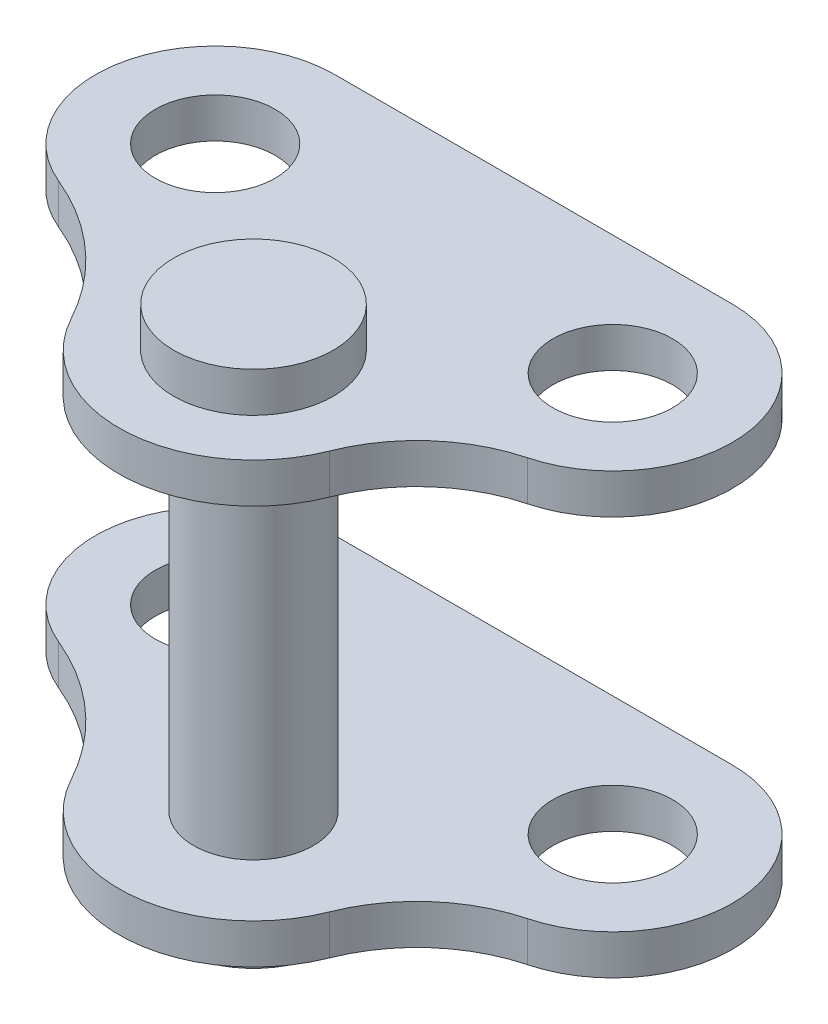
ISO-10303-21;
HEADER;
FILE_DESCRIPTION(('STEP AP214'),'2;1');
FILE_NAME('part.step','',(''),(''),'','','');
FILE_SCHEMA(('AUTOMOTIVE_DESIGN { 1 0 10303 214 1 1 1 1 }'));
ENDSEC;
DATA;
#1=APPLICATION_CONTEXT('core data for automotive mechanical design processes');
#2=APPLICATION_PROTOCOL_DEFINITION('international standard','automotive_design',2000,#1);
#3=PRODUCT_CONTEXT('',#1,'mechanical');
#4=PRODUCT('Part','Part','',(#3));
#5=PRODUCT_RELATED_PRODUCT_CATEGORY('part','',(#4));
#6=PRODUCT_DEFINITION_FORMATION('','',#4);
#7=PRODUCT_DEFINITION_CONTEXT('part definition',#1,'design');
#8=PRODUCT_DEFINITION('design','',#6,#7);
#9=PRODUCT_DEFINITION_SHAPE('','',#8);
#10=(LENGTH_UNIT() NAMED_UNIT(*) SI_UNIT(.MILLI.,.METRE.));
#11=(NAMED_UNIT(*) PLANE_ANGLE_UNIT() SI_UNIT($,.RADIAN.));
#12=(NAMED_UNIT(*) SI_UNIT($,.STERADIAN.) SOLID_ANGLE_UNIT());
#13=UNCERTAINTY_MEASURE_WITH_UNIT(LENGTH_MEASURE(1.E-05),#10,'distance_accuracy_value','');
#14=(GEOMETRIC_REPRESENTATION_CONTEXT(3) GLOBAL_UNCERTAINTY_ASSIGNED_CONTEXT((#13)) GLOBAL_UNIT_ASSIGNED_CONTEXT((#10,
#11,#12)) REPRESENTATION_CONTEXT('',''));
#15=CARTESIAN_POINT('',(0.,0.,0.));
#16=DIRECTION('',(0.,0.,1.));
#17=DIRECTION('',(1.,0.,0.));
#18=AXIS2_PLACEMENT_3D('',#15,#16,#17);
#19=CARTESIAN_POINT('',(-12.0416183066735,15.875,13.7069856357759));
#20=DIRECTION('',(0.,1.,0.));
#21=DIRECTION('',(0.,0.,1.));
#22=AXIS2_PLACEMENT_3D('',#19,#20,#21);
#23=CYLINDRICAL_SURFACE('',#22,10.0791971458195);
#24=CARTESIAN_POINT('',(-12.0416183066735,17.4625,13.7069856357759));
#25=DIRECTION('',(0.,-1.,0.));
#26=DIRECTION('',(0.,0.,-1.));
#27=AXIS2_PLACEMENT_3D('',#24,#25,#26);
#28=CIRCLE('',#27,10.0791971458195);
#29=CARTESIAN_POINT('',(-8.17636338143898,17.4625,4.39838641423633));
#30=VERTEX_POINT('',#29);
#31=CARTESIAN_POINT('',(-3.18150834841455,17.4625,8.90191886913695));
#32=VERTEX_POINT('',#31);
#33=EDGE_CURVE('E137',#30,#32,#28,.T.);
#34=ORIENTED_EDGE('',*,*,#33,.F.);
#35=DIRECTION('',(0.,1.,0.));
#36=VECTOR('',#35,1.);
#37=CARTESIAN_POINT('',(-8.17636338143898,15.875,4.39838641423633));
#38=LINE('',#37,#36);
#39=CARTESIAN_POINT('',(-8.17636338143898,15.875,4.39838641423633));
#40=VERTEX_POINT('',#39);
#41=EDGE_CURVE('E12',#40,#30,#38,.T.);
#42=ORIENTED_EDGE('',*,*,#41,.F.);
#43=CARTESIAN_POINT('',(-12.0416183066735,15.875,13.7069856357759));
#44=DIRECTION('',(0.,-1.,0.));
#45=DIRECTION('',(0.,0.,-1.));
#46=AXIS2_PLACEMENT_3D('',#43,#44,#45);
#47=CIRCLE('',#46,10.0791971458195);
#48=CARTESIAN_POINT('',(-3.18150834841455,15.875,8.90191886913695));
#49=VERTEX_POINT('',#48);
#50=EDGE_CURVE('E158',#40,#49,#47,.T.);
#51=ORIENTED_EDGE('',*,*,#50,.T.);
#52=DIRECTION('',(0.,1.,0.));
#53=VECTOR('',#52,1.);
#54=CARTESIAN_POINT('',(-3.18150834841455,15.875,8.90191886913695));
#55=LINE('',#54,#53);
#56=EDGE_CURVE('E89',#49,#32,#55,.T.);
#57=ORIENTED_EDGE('',*,*,#56,.T.);
#58=EDGE_LOOP('',(#34,#42,#51,#57));
#59=FACE_BOUND('',#58,.T.);
#60=ADVANCED_FACE('F45',(#59),#23,.F.);
#61=CARTESIAN_POINT('',(-6.35,15.875,0.));
#62=DIRECTION('',(0.,1.,0.));
#63=DIRECTION('',(0.,0.,1.));
#64=AXIS2_PLACEMENT_3D('',#61,#62,#63);
#65=CYLINDRICAL_SURFACE('',#64,4.7625);
#66=CARTESIAN_POINT('',(-6.35,17.4625,0.));
#67=DIRECTION('',(0.,-1.,0.));
#68=DIRECTION('',(0.,0.,-1.));
#69=AXIS2_PLACEMENT_3D('',#66,#67,#68);
#70=CIRCLE('',#69,4.7625);
#71=CARTESIAN_POINT('',(-6.35,17.4625,-4.7625));
#72=VERTEX_POINT('',#71);
#73=EDGE_CURVE('E140',#30,#72,#70,.T.);
#74=ORIENTED_EDGE('',*,*,#73,.T.);
#75=DIRECTION('',(0.,1.,0.));
#76=VECTOR('',#75,1.);
#77=CARTESIAN_POINT('',(-6.35,15.875,-4.7625));
#78=LINE('',#77,#76);
#79=CARTESIAN_POINT('',(-6.35,15.875,-4.7625));
#80=VERTEX_POINT('',#79);
#81=EDGE_CURVE('E53',#80,#72,#78,.T.);
#82=ORIENTED_EDGE('',*,*,#81,.F.);
#83=CARTESIAN_POINT('',(-6.35,15.875,0.));
#84=DIRECTION('',(0.,-1.,0.));
#85=DIRECTION('',(0.,0.,-1.));
#86=AXIS2_PLACEMENT_3D('',#83,#84,#85);
#87=CIRCLE('',#86,4.7625);
#88=EDGE_CURVE('E172',#40,#80,#87,.T.);
#89=ORIENTED_EDGE('',*,*,#88,.F.);
#90=ORIENTED_EDGE('',*,*,#41,.T.);
#91=EDGE_LOOP('',(#74,#82,#89,#90));
#92=FACE_BOUND('',#91,.T.);
#93=ADVANCED_FACE('F175',(#92),#65,.T.);
#94=CARTESIAN_POINT('',(0.,15.875,-4.7625));
#95=DIRECTION('',(0.,0.,1.));
#96=DIRECTION('',(1.,0.,0.));
#97=AXIS2_PLACEMENT_3D('',#94,#95,#96);
#98=PLANE('',#97);
#99=DIRECTION('',(1.,0.,0.));
#100=VECTOR('',#99,1.);
#101=CARTESIAN_POINT('',(0.,17.4625,-4.7625));
#102=LINE('',#101,#100);
#103=CARTESIAN_POINT('',(9.4615,17.4625,-4.7625));
#104=VERTEX_POINT('',#103);
#105=EDGE_CURVE('E142',#72,#104,#102,.T.);
#106=ORIENTED_EDGE('',*,*,#105,.T.);
#107=DIRECTION('',(0.,1.,0.));
#108=VECTOR('',#107,1.);
#109=CARTESIAN_POINT('',(9.4615,15.875,-4.7625));
#110=LINE('',#109,#108);
#111=CARTESIAN_POINT('',(9.4615,15.875,-4.7625));
#112=VERTEX_POINT('',#111);
#113=EDGE_CURVE('E121',#112,#104,#110,.T.);
#114=ORIENTED_EDGE('',*,*,#113,.F.);
#115=DIRECTION('',(1.,0.,0.));
#116=VECTOR('',#115,1.);
#117=CARTESIAN_POINT('',(0.,15.875,-4.7625));
#118=LINE('',#117,#116);
#119=EDGE_CURVE('E108',#80,#112,#118,.T.);
#120=ORIENTED_EDGE('',*,*,#119,.F.);
#121=ORIENTED_EDGE('',*,*,#81,.T.);
#122=EDGE_LOOP('',(#106,#114,#120,#121));
#123=FACE_BOUND('',#122,.T.);
#124=ADVANCED_FACE('F165',(#123),#98,.F.);
#125=CARTESIAN_POINT('',(9.4615,15.875,0.));
#126=DIRECTION('',(0.,1.,0.));
#127=DIRECTION('',(0.,0.,1.));
#128=AXIS2_PLACEMENT_3D('',#125,#126,#127);
#129=CYLINDRICAL_SURFACE('',#128,4.7625);
#130=CARTESIAN_POINT('',(9.4615,17.4625,0.));
#131=DIRECTION('',(0.,-1.,0.));
#132=DIRECTION('',(0.,0.,-1.));
#133=AXIS2_PLACEMENT_3D('',#130,#131,#132);
#134=CIRCLE('',#133,4.7625);
#135=CARTESIAN_POINT('',(10.6744794197619,17.4625,4.60544104046877));
#136=VERTEX_POINT('',#135);
#137=EDGE_CURVE('E117',#104,#136,#134,.T.);
#138=ORIENTED_EDGE('',*,*,#137,.T.);
#139=DIRECTION('',(0.,1.,0.));
#140=VECTOR('',#139,1.);
#141=CARTESIAN_POINT('',(10.6744794197619,15.875,4.60544104046877));
#142=LINE('',#141,#140);
#143=CARTESIAN_POINT('',(10.6744794197619,15.875,4.60544104046877));
#144=VERTEX_POINT('',#143);
#145=EDGE_CURVE('E114',#144,#136,#142,.T.);
#146=ORIENTED_EDGE('',*,*,#145,.F.);
#147=CARTESIAN_POINT('',(9.4615,15.875,0.));
#148=DIRECTION('',(0.,-1.,0.));
#149=DIRECTION('',(0.,0.,-1.));
#150=AXIS2_PLACEMENT_3D('',#147,#148,#149);
#151=CIRCLE('',#150,4.7625);
#152=EDGE_CURVE('E101',#112,#144,#151,.T.);
#153=ORIENTED_EDGE('',*,*,#152,.F.);
#154=ORIENTED_EDGE('',*,*,#113,.T.);
#155=EDGE_LOOP('',(#138,#146,#153,#154));
#156=FACE_BOUND('',#155,.T.);
#157=ADVANCED_FACE('F115',(#156),#129,.T.);
#158=CARTESIAN_POINT('',(12.2461179670708,15.875,10.5726392868988));
#159=DIRECTION('',(0.,1.,0.));
#160=DIRECTION('',(0.,0.,1.));
#161=AXIS2_PLACEMENT_3D('',#158,#159,#160);
#162=CYLINDRICAL_SURFACE('',#161,6.17069709478477);
#163=CARTESIAN_POINT('',(12.2461179670708,17.4625,10.5726392868988));
#164=DIRECTION('',(0.,-1.,0.));
#165=DIRECTION('',(0.,0.,-1.));
#166=AXIS2_PLACEMENT_3D('',#163,#164,#165);
#167=CIRCLE('',#166,6.17069709478477);
#168=CARTESIAN_POINT('',(6.50462586633258,17.4625,8.31149552925187));
#169=VERTEX_POINT('',#168);
#170=EDGE_CURVE('E145',#169,#136,#167,.T.);
#171=ORIENTED_EDGE('',*,*,#170,.F.);
#172=DIRECTION('',(0.,1.,0.));
#173=VECTOR('',#172,1.);
#174=CARTESIAN_POINT('',(6.50462586633258,15.875,8.31149552925187));
#175=LINE('',#174,#173);
#176=CARTESIAN_POINT('',(6.50462586633258,15.875,8.31149552925187));
#177=VERTEX_POINT('',#176);
#178=EDGE_CURVE('E82',#177,#169,#175,.T.);
#179=ORIENTED_EDGE('',*,*,#178,.F.);
#180=CARTESIAN_POINT('',(12.2461179670708,15.875,10.5726392868988));
#181=DIRECTION('',(0.,-1.,0.));
#182=DIRECTION('',(0.,0.,-1.));
#183=AXIS2_PLACEMENT_3D('',#180,#181,#182);
#184=CIRCLE('',#183,6.17069709478477);
#185=EDGE_CURVE('E106',#177,#144,#184,.T.);
#186=ORIENTED_EDGE('',*,*,#185,.T.);
#187=ORIENTED_EDGE('',*,*,#145,.T.);
#188=EDGE_LOOP('',(#171,#179,#186,#187));
#189=FACE_BOUND('',#188,.T.);
#190=ADVANCED_FACE('F123',(#189),#162,.F.);
#191=CARTESIAN_POINT('',(9.4615,15.875,0.));
#192=DIRECTION('',(0.,1.,0.));
#193=DIRECTION('',(0.,0.,1.));
#194=AXIS2_PLACEMENT_3D('',#191,#192,#193);
#195=CYLINDRICAL_SURFACE('',#194,2.38125);
#196=CARTESIAN_POINT('',(9.4615,15.875,0.));
#197=DIRECTION('',(0.,-1.,0.));
#198=DIRECTION('',(0.,0.,-1.));
#199=AXIS2_PLACEMENT_3D('',#196,#197,#198);
#200=CIRCLE('',#199,2.38125);
#201=CARTESIAN_POINT('',(9.4615,15.875,-2.38125));
#202=VERTEX_POINT('',#201);
#203=EDGE_CURVE('E131',#202,#202,#200,.T.);
#204=ORIENTED_EDGE('',*,*,#203,.T.);
#205=EDGE_LOOP('',(#204));
#206=FACE_BOUND('',#205,.T.);
#207=CARTESIAN_POINT('',(9.4615,17.4625,0.));
#208=DIRECTION('',(0.,-1.,0.));
#209=DIRECTION('',(0.,0.,-1.));
#210=AXIS2_PLACEMENT_3D('',#207,#208,#209);
#211=CIRCLE('',#210,2.38125);
#212=CARTESIAN_POINT('',(9.4615,17.4625,-2.38125));
#213=VERTEX_POINT('',#212);
#214=EDGE_CURVE('E152',#213,#213,#211,.T.);
#215=ORIENTED_EDGE('',*,*,#214,.F.);
#216=EDGE_LOOP('',(#215));
#217=FACE_BOUND('',#216,.T.);
#218=ADVANCED_FACE('F187',(#206,#217),#195,.F.);
#219=CARTESIAN_POINT('',(1.524,15.875,6.35));
#220=DIRECTION('',(0.,1.,0.));
#221=DIRECTION('',(0.,0.,1.));
#222=AXIS2_PLACEMENT_3D('',#219,#220,#221);
#223=CYLINDRICAL_SURFACE('',#222,2.38125);
#224=CARTESIAN_POINT('',(1.524,15.875,6.35));
#225=DIRECTION('',(0.,-1.,0.));
#226=DIRECTION('',(0.,0.,-1.));
#227=AXIS2_PLACEMENT_3D('',#224,#225,#226);
#228=CIRCLE('',#227,2.38125);
#229=CARTESIAN_POINT('',(1.524,15.875,3.96875));
#230=VERTEX_POINT('',#229);
#231=EDGE_CURVE('E125',#230,#230,#228,.F.);
#232=ORIENTED_EDGE('',*,*,#231,.F.);
#233=EDGE_LOOP('',(#232));
#234=FACE_BOUND('',#233,.T.);
#235=CARTESIAN_POINT('',(1.524,17.4625,6.35));
#236=DIRECTION('',(0.,-1.,0.));
#237=DIRECTION('',(0.,0.,-1.));
#238=AXIS2_PLACEMENT_3D('',#235,#236,#237);
#239=CIRCLE('',#238,2.38125);
#240=CARTESIAN_POINT('',(1.524,17.4625,3.96875));
#241=VERTEX_POINT('',#240);
#242=EDGE_CURVE('E149',#241,#241,#239,.F.);
#243=ORIENTED_EDGE('',*,*,#242,.T.);
#244=EDGE_LOOP('',(#243));
#245=FACE_BOUND('',#244,.T.);
#246=ADVANCED_FACE('F191',(#234,#245),#223,.F.);
#247=CARTESIAN_POINT('',(1.524,15.875,6.35));
#248=DIRECTION('',(0.,1.,0.));
#249=DIRECTION('',(0.,0.,1.));
#250=AXIS2_PLACEMENT_3D('',#247,#248,#249);
#251=CYLINDRICAL_SURFACE('',#250,5.35295233788386);
#252=CARTESIAN_POINT('',(1.524,17.4625,6.35));
#253=DIRECTION('',(0.,-1.,0.));
#254=DIRECTION('',(0.,0.,-1.));
#255=AXIS2_PLACEMENT_3D('',#252,#253,#254);
#256=CIRCLE('',#255,5.35295233788386);
#257=EDGE_CURVE('E147',#169,#32,#256,.T.);
#258=ORIENTED_EDGE('',*,*,#257,.T.);
#259=ORIENTED_EDGE('',*,*,#56,.F.);
#260=CARTESIAN_POINT('',(1.524,15.875,6.35));
#261=DIRECTION('',(0.,-1.,0.));
#262=DIRECTION('',(0.,0.,-1.));
#263=AXIS2_PLACEMENT_3D('',#260,#261,#262);
#264=CIRCLE('',#263,5.35295233788386);
#265=EDGE_CURVE('E61',#177,#49,#264,.T.);
#266=ORIENTED_EDGE('',*,*,#265,.F.);
#267=ORIENTED_EDGE('',*,*,#178,.T.);
#268=EDGE_LOOP('',(#258,#259,#266,#267));
#269=FACE_BOUND('',#268,.T.);
#270=ADVANCED_FACE('F171',(#269),#251,.T.);
#271=CARTESIAN_POINT('',(-6.35,15.875,0.));
#272=DIRECTION('',(0.,1.,0.));
#273=DIRECTION('',(0.,0.,1.));
#274=AXIS2_PLACEMENT_3D('',#271,#272,#273);
#275=CYLINDRICAL_SURFACE('',#274,2.38125);
#276=CARTESIAN_POINT('',(-6.35,15.875,0.));
#277=DIRECTION('',(0.,-1.,0.));
#278=DIRECTION('',(0.,0.,-1.));
#279=AXIS2_PLACEMENT_3D('',#276,#277,#278);
#280=CIRCLE('',#279,2.38125);
#281=CARTESIAN_POINT('',(-6.35,15.875,-2.38125));
#282=VERTEX_POINT('',#281);
#283=EDGE_CURVE('E134',#282,#282,#280,.T.);
#284=ORIENTED_EDGE('',*,*,#283,.T.);
#285=EDGE_LOOP('',(#284));
#286=FACE_BOUND('',#285,.T.);
#287=CARTESIAN_POINT('',(-6.35,17.4625,0.));
#288=DIRECTION('',(0.,-1.,0.));
#289=DIRECTION('',(0.,0.,-1.));
#290=AXIS2_PLACEMENT_3D('',#287,#288,#289);
#291=CIRCLE('',#290,2.38125);
#292=CARTESIAN_POINT('',(-6.35,17.4625,-2.38125));
#293=VERTEX_POINT('',#292);
#294=EDGE_CURVE('E155',#293,#293,#291,.T.);
#295=ORIENTED_EDGE('',*,*,#294,.F.);
#296=EDGE_LOOP('',(#295));
#297=FACE_BOUND('',#296,.T.);
#298=ADVANCED_FACE('F190',(#286,#297),#275,.F.);
#299=CARTESIAN_POINT('',(0.,15.875,0.));
#300=DIRECTION('',(0.,-1.,0.));
#301=DIRECTION('',(0.,0.,-1.));
#302=AXIS2_PLACEMENT_3D('',#299,#300,#301);
#303=PLANE('',#302);
#304=ORIENTED_EDGE('',*,*,#50,.F.);
#305=ORIENTED_EDGE('',*,*,#88,.T.);
#306=ORIENTED_EDGE('',*,*,#119,.T.);
#307=ORIENTED_EDGE('',*,*,#152,.T.);
#308=ORIENTED_EDGE('',*,*,#185,.F.);
#309=ORIENTED_EDGE('',*,*,#265,.T.);
#310=EDGE_LOOP('',(#304,#305,#306,#307,#308,#309));
#311=FACE_BOUND('',#310,.T.);
#312=ORIENTED_EDGE('',*,*,#231,.T.);
#313=EDGE_LOOP('',(#312));
#314=FACE_BOUND('',#313,.T.);
#315=ORIENTED_EDGE('',*,*,#203,.F.);
#316=EDGE_LOOP('',(#315));
#317=FACE_BOUND('',#316,.T.);
#318=ORIENTED_EDGE('',*,*,#283,.F.);
#319=EDGE_LOOP('',(#318));
#320=FACE_BOUND('',#319,.T.);
#321=ADVANCED_FACE('F103',(#311,#314,#317,#320),#303,.T.);
#322=CARTESIAN_POINT('',(0.,17.4625,0.));
#323=DIRECTION('',(0.,-1.,0.));
#324=DIRECTION('',(0.,0.,-1.));
#325=AXIS2_PLACEMENT_3D('',#322,#323,#324);
#326=PLANE('',#325);
#327=ORIENTED_EDGE('',*,*,#33,.T.);
#328=ORIENTED_EDGE('',*,*,#257,.F.);
#329=ORIENTED_EDGE('',*,*,#170,.T.);
#330=ORIENTED_EDGE('',*,*,#137,.F.);
#331=ORIENTED_EDGE('',*,*,#105,.F.);
#332=ORIENTED_EDGE('',*,*,#73,.F.);
#333=EDGE_LOOP('',(#327,#328,#329,#330,#331,#332));
#334=FACE_BOUND('',#333,.T.);
#335=ORIENTED_EDGE('',*,*,#242,.F.);
#336=EDGE_LOOP('',(#335));
#337=FACE_BOUND('',#336,.T.);
#338=ORIENTED_EDGE('',*,*,#214,.T.);
#339=EDGE_LOOP('',(#338));
#340=FACE_BOUND('',#339,.T.);
#341=ORIENTED_EDGE('',*,*,#294,.T.);
#342=EDGE_LOOP('',(#341));
#343=FACE_BOUND('',#342,.T.);
#344=ADVANCED_FACE('F169',(#334,#337,#340,#343),#326,.F.);
#345=CLOSED_SHELL('',(#60,#93,#124,#157,#190,#218,#246,#270,#298,#321,#344));
#346=MANIFOLD_SOLID_BREP('B2',#345);
#347=CARTESIAN_POINT('',(1.524,19.05,6.35));
#348=DIRECTION('',(0.,-1.,0.));
#349=DIRECTION('',(0.,0.,-1.));
#350=AXIS2_PLACEMENT_3D('',#347,#348,#349);
#351=CYLINDRICAL_SURFACE('',#350,2.38125);
#352=CARTESIAN_POINT('',(1.524,1.5875,6.35));
#353=DIRECTION('',(0.,1.,0.));
#354=DIRECTION('',(0.,0.,1.));
#355=AXIS2_PLACEMENT_3D('',#352,#353,#354);
#356=CIRCLE('',#355,2.38125);
#357=CARTESIAN_POINT('',(1.524,1.5875,3.96875));
#358=VERTEX_POINT('',#357);
#359=EDGE_CURVE('E408',#358,#358,#356,.T.);
#360=CARTESIAN_POINT('',(1.524,17.4625,6.35));
#361=DIRECTION('',(0.,1.,0.));
#362=DIRECTION('',(0.,0.,1.));
#363=AXIS2_PLACEMENT_3D('',#360,#361,#362);
#364=CIRCLE('',#363,2.38125);
#365=CARTESIAN_POINT('',(1.524,17.4625,3.96875));
#366=VERTEX_POINT('',#365);
#367=EDGE_CURVE('E43',#366,#366,#364,.T.);
#368=CARTESIAN_POINT('',(1.524,1.5875,3.96875));
#369=CARTESIAN_POINT('',(1.524,1.75286458333333,3.96875));
#370=CARTESIAN_POINT('',(1.524,1.91822916666666,3.96875));
#371=CARTESIAN_POINT('',(1.524,2.24895833333333,3.96875));
#372=CARTESIAN_POINT('',(1.524,2.41432291666667,3.96875));
#373=CARTESIAN_POINT('',(1.524,2.74505208333333,3.96875));
#374=CARTESIAN_POINT('',(1.524,2.91041666666667,3.96875));
#375=CARTESIAN_POINT('',(1.524,3.24114583333333,3.96875));
#376=CARTESIAN_POINT('',(1.524,3.40651041666666,3.96875));
#377=CARTESIAN_POINT('',(1.524,3.73723958333333,3.96875));
#378=CARTESIAN_POINT('',(1.524,3.90260416666666,3.96875));
#379=CARTESIAN_POINT('',(1.524,4.23333333333333,3.96875));
#380=CARTESIAN_POINT('',(1.524,4.39869791666667,3.96875));
#381=CARTESIAN_POINT('',(1.524,4.72942708333333,3.96875));
#382=CARTESIAN_POINT('',(1.524,4.89479166666666,3.96875));
#383=CARTESIAN_POINT('',(1.524,5.22552083333333,3.96875));
#384=CARTESIAN_POINT('',(1.524,5.39088541666667,3.96875));
#385=CARTESIAN_POINT('',(1.524,5.72161458333333,3.96875));
#386=CARTESIAN_POINT('',(1.524,5.88697916666667,3.96875));
#387=CARTESIAN_POINT('',(1.524,6.21770833333333,3.96875));
#388=CARTESIAN_POINT('',(1.524,6.38307291666667,3.96875));
#389=CARTESIAN_POINT('',(1.524,6.71380208333333,3.96875));
#390=CARTESIAN_POINT('',(1.524,6.87916666666667,3.96875));
#391=CARTESIAN_POINT('',(1.524,7.20989583333333,3.96875));
#392=CARTESIAN_POINT('',(1.524,7.37526041666667,3.96875));
#393=CARTESIAN_POINT('',(1.524,7.70598958333333,3.96875));
#394=CARTESIAN_POINT('',(1.524,7.87135416666667,3.96875));
#395=CARTESIAN_POINT('',(1.524,8.20208333333333,3.96875));
#396=CARTESIAN_POINT('',(1.524,8.36744791666667,3.96875));
#397=CARTESIAN_POINT('',(1.524,8.69817708333333,3.96875));
#398=CARTESIAN_POINT('',(1.524,8.86354166666667,3.96875));
#399=CARTESIAN_POINT('',(1.524,9.19427083333333,3.96875));
#400=CARTESIAN_POINT('',(1.524,9.35963541666667,3.96875));
#401=CARTESIAN_POINT('',(1.524,9.69036458333333,3.96875));
#402=CARTESIAN_POINT('',(1.524,9.85572916666667,3.96875));
#403=CARTESIAN_POINT('',(1.524,10.1864583333333,3.96875));
#404=CARTESIAN_POINT('',(1.524,10.3518229166667,3.96875));
#405=CARTESIAN_POINT('',(1.524,10.6825520833333,3.96875));
#406=CARTESIAN_POINT('',(1.524,10.8479166666667,3.96875));
#407=CARTESIAN_POINT('',(1.524,11.1786458333333,3.96875));
#408=CARTESIAN_POINT('',(1.524,11.3440104166667,3.96875));
#409=CARTESIAN_POINT('',(1.524,11.6747395833333,3.96875));
#410=CARTESIAN_POINT('',(1.524,11.8401041666667,3.96875));
#411=CARTESIAN_POINT('',(1.524,12.1708333333333,3.96875));
#412=CARTESIAN_POINT('',(1.524,12.3361979166667,3.96875));
#413=CARTESIAN_POINT('',(1.524,12.6669270833333,3.96875));
#414=CARTESIAN_POINT('',(1.524,12.8322916666667,3.96875));
#415=CARTESIAN_POINT('',(1.524,13.1630208333333,3.96875));
#416=CARTESIAN_POINT('',(1.524,13.3283854166667,3.96875));
#417=CARTESIAN_POINT('',(1.524,13.6591145833333,3.96875));
#418=CARTESIAN_POINT('',(1.524,13.8244791666667,3.96875));
#419=CARTESIAN_POINT('',(1.524,14.1552083333333,3.96875));
#420=CARTESIAN_POINT('',(1.524,14.3205729166667,3.96875));
#421=CARTESIAN_POINT('',(1.524,14.6513020833333,3.96875));
#422=CARTESIAN_POINT('',(1.524,14.8166666666667,3.96875));
#423=CARTESIAN_POINT('',(1.524,15.1473958333333,3.96875));
#424=CARTESIAN_POINT('',(1.524,15.3127604166667,3.96875));
#425=CARTESIAN_POINT('',(1.524,15.6434895833333,3.96875));
#426=CARTESIAN_POINT('',(1.524,15.8088541666667,3.96875));
#427=CARTESIAN_POINT('',(1.524,16.1395833333333,3.96875));
#428=CARTESIAN_POINT('',(1.524,16.3049479166667,3.96875));
#429=CARTESIAN_POINT('',(1.524,16.6356770833333,3.96875));
#430=CARTESIAN_POINT('',(1.524,16.8010416666667,3.96875));
#431=CARTESIAN_POINT('',(1.524,17.1317708333333,3.96875));
#432=CARTESIAN_POINT('',(1.524,17.2971354166667,3.96875));
#433=CARTESIAN_POINT('',(1.524,17.4625,3.96875));
#434=B_SPLINE_CURVE_WITH_KNOTS('',3,(#368,#369,#370,#371,#372,#373,#374,#375,#376,#377,#378,
#379,#380,#381,#382,#383,#384,#385,#386,#387,#388,#389,#390,#391,#392,#393,#394,#395,#396,#397,
#398,#399,#400,#401,#402,#403,#404,#405,#406,#407,#408,#409,#410,#411,#412,#413,#414,#415,#416,
#417,#418,#419,#420,#421,#422,#423,#424,#425,#426,#427,#428,#429,#430,#431,#432,#433),
.UNSPECIFIED.,.F.,.F.,(4,2,2,2,2,2,2,2,2,2,2,2,2,2,2,2,2,2,2,2,2,2,2,2,2,2,2,2,2,2,2,2,4),(0.,
0.496093749999999,0.992187500000002,1.48828125,1.984375,2.48046875,2.9765625,3.47265625,3.96875,
4.46484375,4.9609375,5.45703125,5.953125,6.44921875,6.9453125,7.44140625,7.9375,8.43359375,
8.9296875,9.42578125,9.921875,10.41796875,10.9140625,11.41015625,11.90625,12.40234375,
12.8984375,13.39453125,13.890625,14.38671875,14.8828125,15.37890625,15.875),.UNSPECIFIED.);
#435=EDGE_CURVE('BSEAM320',#358,#366,#434,.T.);
#436=ORIENTED_EDGE('',*,*,#359,.T.);
#437=ORIENTED_EDGE('',*,*,#367,.F.);
#438=ORIENTED_EDGE('',*,*,#435,.T.);
#439=ORIENTED_EDGE('',*,*,#435,.F.);
#440=EDGE_LOOP('',(#436,#438,#437,#439));
#441=FACE_BOUND('',#440,.T.);
#442=ADVANCED_FACE('F320',(#441),#351,.T.);
#443=CARTESIAN_POINT('',(-12.0416183066734,1.5875,13.7069856357759));
#444=DIRECTION('',(0.,-1.,0.));
#445=DIRECTION('',(0.,0.,-1.));
#446=AXIS2_PLACEMENT_3D('',#443,#444,#445);
#447=CYLINDRICAL_SURFACE('',#446,10.0791971458195);
#448=CARTESIAN_POINT('',(-12.0416183066734,0.,13.7069856357759));
#449=DIRECTION('',(0.,1.,0.));
#450=DIRECTION('',(0.,0.,1.));
#451=AXIS2_PLACEMENT_3D('',#448,#449,#450);
#452=CIRCLE('',#451,10.0791971458195);
#453=CARTESIAN_POINT('',(-8.17636338143898,0.,4.39838641423634));
#454=VERTEX_POINT('',#453);
#455=CARTESIAN_POINT('',(-3.18150834841456,0.,8.90191886913694));
#456=VERTEX_POINT('',#455);
#457=EDGE_CURVE('E415',#454,#456,#452,.F.);
#458=ORIENTED_EDGE('',*,*,#457,.T.);
#459=DIRECTION('',(0.,-1.,0.));
#460=VECTOR('',#459,1.);
#461=CARTESIAN_POINT('',(-3.18150834841456,1.5875,8.90191886913694));
#462=LINE('',#461,#460);
#463=CARTESIAN_POINT('',(-3.18150834841456,1.5875,8.90191886913694));
#464=VERTEX_POINT('',#463);
#465=EDGE_CURVE('E440',#464,#456,#462,.T.);
#466=ORIENTED_EDGE('',*,*,#465,.F.);
#467=CARTESIAN_POINT('',(-12.0416183066734,1.5875,13.7069856357759));
#468=DIRECTION('',(0.,1.,0.));
#469=DIRECTION('',(0.,0.,1.));
#470=AXIS2_PLACEMENT_3D('',#467,#468,#469);
#471=CIRCLE('',#470,10.0791971458195);
#472=CARTESIAN_POINT('',(-8.17636338143898,1.5875,4.39838641423634));
#473=VERTEX_POINT('',#472);
#474=EDGE_CURVE('E433',#473,#464,#471,.F.);
#475=ORIENTED_EDGE('',*,*,#474,.F.);
#476=DIRECTION('',(0.,-1.,0.));
#477=VECTOR('',#476,1.);
#478=CARTESIAN_POINT('',(-8.17636338143898,1.5875,4.39838641423634));
#479=LINE('',#478,#477);
#480=EDGE_CURVE('E414',#473,#454,#479,.T.);
#481=ORIENTED_EDGE('',*,*,#480,.T.);
#482=EDGE_LOOP('',(#458,#466,#475,#481));
#483=FACE_BOUND('',#482,.T.);
#484=ADVANCED_FACE('F322',(#483),#447,.F.);
#485=CARTESIAN_POINT('',(1.524,1.5875,6.35));
#486=DIRECTION('',(0.,-1.,0.));
#487=DIRECTION('',(0.,0.,-1.));
#488=AXIS2_PLACEMENT_3D('',#485,#486,#487);
#489=CYLINDRICAL_SURFACE('',#488,5.35295233788386);
#490=CARTESIAN_POINT('',(1.524,0.,6.35));
#491=DIRECTION('',(0.,1.,0.));
#492=DIRECTION('',(0.,0.,1.));
#493=AXIS2_PLACEMENT_3D('',#490,#491,#492);
#494=CIRCLE('',#493,5.35295233788386);
#495=CARTESIAN_POINT('',(6.50462586633258,0.,8.31149552925186));
#496=VERTEX_POINT('',#495);
#497=EDGE_CURVE('E418',#456,#496,#494,.T.);
#498=ORIENTED_EDGE('',*,*,#497,.T.);
#499=DIRECTION('',(0.,-1.,0.));
#500=VECTOR('',#499,1.);
#501=CARTESIAN_POINT('',(6.50462586633258,1.5875,8.31149552925186));
#502=LINE('',#501,#500);
#503=CARTESIAN_POINT('',(6.50462586633258,1.5875,8.31149552925186));
#504=VERTEX_POINT('',#503);
#505=EDGE_CURVE('E437',#504,#496,#502,.T.);
#506=ORIENTED_EDGE('',*,*,#505,.F.);
#507=CARTESIAN_POINT('',(1.524,1.5875,6.35));
#508=DIRECTION('',(0.,1.,0.));
#509=DIRECTION('',(0.,0.,1.));
#510=AXIS2_PLACEMENT_3D('',#507,#508,#509);
#511=CIRCLE('',#510,5.35295233788386);
#512=EDGE_CURVE('E371',#464,#504,#511,.T.);
#513=ORIENTED_EDGE('',*,*,#512,.F.);
#514=ORIENTED_EDGE('',*,*,#465,.T.);
#515=EDGE_LOOP('',(#498,#506,#513,#514));
#516=FACE_BOUND('',#515,.T.);
#517=ADVANCED_FACE('F476',(#516),#489,.T.);
#518=CARTESIAN_POINT('',(12.2461179670708,1.5875,10.5726392868988));
#519=DIRECTION('',(0.,-1.,0.));
#520=DIRECTION('',(0.,0.,-1.));
#521=AXIS2_PLACEMENT_3D('',#518,#519,#520);
#522=CYLINDRICAL_SURFACE('',#521,6.17069709478476);
#523=CARTESIAN_POINT('',(12.2461179670708,0.,10.5726392868988));
#524=DIRECTION('',(0.,1.,0.));
#525=DIRECTION('',(0.,0.,1.));
#526=AXIS2_PLACEMENT_3D('',#523,#524,#525);
#527=CIRCLE('',#526,6.17069709478476);
#528=CARTESIAN_POINT('',(10.6744794197619,0.,4.60544104046877));
#529=VERTEX_POINT('',#528);
#530=EDGE_CURVE('E421',#496,#529,#527,.F.);
#531=ORIENTED_EDGE('',*,*,#530,.T.);
#532=DIRECTION('',(0.,-1.,0.));
#533=VECTOR('',#532,1.);
#534=CARTESIAN_POINT('',(10.6744794197619,1.5875,4.60544104046877));
#535=LINE('',#534,#533);
#536=CARTESIAN_POINT('',(10.6744794197619,1.5875,4.60544104046877));
#537=VERTEX_POINT('',#536);
#538=EDGE_CURVE('E398',#537,#529,#535,.T.);
#539=ORIENTED_EDGE('',*,*,#538,.F.);
#540=CARTESIAN_POINT('',(12.2461179670708,1.5875,10.5726392868988));
#541=DIRECTION('',(0.,1.,0.));
#542=DIRECTION('',(0.,0.,1.));
#543=AXIS2_PLACEMENT_3D('',#540,#541,#542);
#544=CIRCLE('',#543,6.17069709478476);
#545=EDGE_CURVE('E385',#504,#537,#544,.F.);
#546=ORIENTED_EDGE('',*,*,#545,.F.);
#547=ORIENTED_EDGE('',*,*,#505,.T.);
#548=EDGE_LOOP('',(#531,#539,#546,#547));
#549=FACE_BOUND('',#548,.T.);
#550=ADVANCED_FACE('F508',(#549),#522,.F.);
#551=CARTESIAN_POINT('',(9.4615,1.5875,0.));
#552=DIRECTION('',(0.,-1.,0.));
#553=DIRECTION('',(0.,0.,-1.));
#554=AXIS2_PLACEMENT_3D('',#551,#552,#553);
#555=CYLINDRICAL_SURFACE('',#554,4.7625);
#556=CARTESIAN_POINT('',(9.4615,0.,0.));
#557=DIRECTION('',(0.,1.,0.));
#558=DIRECTION('',(0.,0.,1.));
#559=AXIS2_PLACEMENT_3D('',#556,#557,#558);
#560=CIRCLE('',#559,4.7625);
#561=CARTESIAN_POINT('',(9.39800564369196,0.,-4.76207672310275));
#562=VERTEX_POINT('',#561);
#563=EDGE_CURVE('E394',#529,#562,#560,.T.);
#564=ORIENTED_EDGE('',*,*,#563,.T.);
#565=DIRECTION('',(0.,-1.,0.));
#566=VECTOR('',#565,1.);
#567=CARTESIAN_POINT('',(9.39800564369196,1.5875,-4.76207672310275));
#568=LINE('',#567,#566);
#569=CARTESIAN_POINT('',(9.39800564369196,1.5875,-4.76207672310275));
#570=VERTEX_POINT('',#569);
#571=EDGE_CURVE('E391',#570,#562,#568,.T.);
#572=ORIENTED_EDGE('',*,*,#571,.F.);
#573=CARTESIAN_POINT('',(9.4615,1.5875,0.));
#574=DIRECTION('',(0.,1.,0.));
#575=DIRECTION('',(0.,0.,1.));
#576=AXIS2_PLACEMENT_3D('',#573,#574,#575);
#577=CIRCLE('',#576,4.7625);
#578=EDGE_CURVE('E378',#537,#570,#577,.T.);
#579=ORIENTED_EDGE('',*,*,#578,.F.);
#580=ORIENTED_EDGE('',*,*,#538,.T.);
#581=EDGE_LOOP('',(#564,#572,#579,#580));
#582=FACE_BOUND('',#581,.T.);
#583=ADVANCED_FACE('F392',(#582),#555,.T.);
#584=CARTESIAN_POINT('',(0.00012800249276314,1.5875,-4.76232932045245));
#585=DIRECTION('',(2.68781270894432E-05,0.,-0.999999999638783));
#586=DIRECTION('',(-0.999999999638783,0.,-2.68781270894432E-05));
#587=AXIS2_PLACEMENT_3D('',#584,#585,#586);
#588=PLANE('',#587);
#589=DIRECTION('',(0.999999999638783,0.,2.68781270894433E-05));
#590=VECTOR('',#589,1.);
#591=CARTESIAN_POINT('',(0.00012800249276314,0.,-4.76232932045245));
#592=LINE('',#591,#590);
#593=CARTESIAN_POINT('',(-6.35,0.,-4.7625));
#594=VERTEX_POINT('',#593);
#595=EDGE_CURVE('E424',#594,#562,#592,.T.);
#596=ORIENTED_EDGE('',*,*,#595,.F.);
#597=DIRECTION('',(0.,-1.,0.));
#598=VECTOR('',#597,1.);
#599=CARTESIAN_POINT('',(-6.35,1.5875,-4.7625));
#600=LINE('',#599,#598);
#601=CARTESIAN_POINT('',(-6.35,1.5875,-4.7625));
#602=VERTEX_POINT('',#601);
#603=EDGE_CURVE('E359',#602,#594,#600,.T.);
#604=ORIENTED_EDGE('',*,*,#603,.F.);
#605=DIRECTION('',(0.999999999638783,0.,2.68781270894433E-05));
#606=VECTOR('',#605,1.);
#607=CARTESIAN_POINT('',(0.00012800249276314,1.5875,-4.76232932045245));
#608=LINE('',#607,#606);
#609=EDGE_CURVE('E383',#602,#570,#608,.T.);
#610=ORIENTED_EDGE('',*,*,#609,.T.);
#611=ORIENTED_EDGE('',*,*,#571,.T.);
#612=EDGE_LOOP('',(#596,#604,#610,#611));
#613=FACE_BOUND('',#612,.T.);
#614=ADVANCED_FACE('F400',(#613),#588,.T.);
#615=CARTESIAN_POINT('',(-6.35,1.5875,0.));
#616=DIRECTION('',(0.,-1.,0.));
#617=DIRECTION('',(0.,0.,-1.));
#618=AXIS2_PLACEMENT_3D('',#615,#616,#617);
#619=CYLINDRICAL_SURFACE('',#618,2.38125);
#620=CARTESIAN_POINT('',(-6.35,1.5875,0.));
#621=DIRECTION('',(0.,1.,0.));
#622=DIRECTION('',(0.,0.,1.));
#623=AXIS2_PLACEMENT_3D('',#620,#621,#622);
#624=CIRCLE('',#623,2.38125);
#625=CARTESIAN_POINT('',(-6.35,1.5875,2.38125));
#626=VERTEX_POINT('',#625);
#627=EDGE_CURVE('E402',#626,#626,#624,.T.);
#628=ORIENTED_EDGE('',*,*,#627,.T.);
#629=EDGE_LOOP('',(#628));
#630=FACE_BOUND('',#629,.T.);
#631=CARTESIAN_POINT('',(-6.35,0.,0.));
#632=DIRECTION('',(0.,1.,0.));
#633=DIRECTION('',(0.,0.,1.));
#634=AXIS2_PLACEMENT_3D('',#631,#632,#633);
#635=CIRCLE('',#634,2.38125);
#636=CARTESIAN_POINT('',(-6.35,0.,2.38125));
#637=VERTEX_POINT('',#636);
#638=EDGE_CURVE('E427',#637,#637,#635,.T.);
#639=ORIENTED_EDGE('',*,*,#638,.F.);
#640=EDGE_LOOP('',(#639));
#641=FACE_BOUND('',#640,.T.);
#642=ADVANCED_FACE('F467',(#630,#641),#619,.F.);
#643=CARTESIAN_POINT('',(-6.35,1.5875,0.));
#644=DIRECTION('',(0.,-1.,0.));
#645=DIRECTION('',(0.,0.,-1.));
#646=AXIS2_PLACEMENT_3D('',#643,#644,#645);
#647=CYLINDRICAL_SURFACE('',#646,4.7625);
#648=CARTESIAN_POINT('',(-6.35,0.,0.));
#649=DIRECTION('',(0.,1.,0.));
#650=DIRECTION('',(0.,0.,1.));
#651=AXIS2_PLACEMENT_3D('',#648,#649,#650);
#652=CIRCLE('',#651,4.7625);
#653=EDGE_CURVE('E362',#594,#454,#652,.T.);
#654=ORIENTED_EDGE('',*,*,#653,.T.);
#655=ORIENTED_EDGE('',*,*,#480,.F.);
#656=CARTESIAN_POINT('',(-6.35,1.5875,0.));
#657=DIRECTION('',(0.,1.,0.));
#658=DIRECTION('',(0.,0.,1.));
#659=AXIS2_PLACEMENT_3D('',#656,#657,#658);
#660=CIRCLE('',#659,4.7625);
#661=EDGE_CURVE('E337',#602,#473,#660,.T.);
#662=ORIENTED_EDGE('',*,*,#661,.F.);
#663=ORIENTED_EDGE('',*,*,#603,.T.);
#664=EDGE_LOOP('',(#654,#655,#662,#663));
#665=FACE_BOUND('',#664,.T.);
#666=ADVANCED_FACE('F459',(#665),#647,.T.);
#667=CARTESIAN_POINT('',(9.4615,1.5875,0.));
#668=DIRECTION('',(0.,-1.,0.));
#669=DIRECTION('',(0.,0.,-1.));
#670=AXIS2_PLACEMENT_3D('',#667,#668,#669);
#671=CYLINDRICAL_SURFACE('',#670,2.38125);
#672=CARTESIAN_POINT('',(9.4615,1.5875,0.));
#673=DIRECTION('',(0.,1.,0.));
#674=DIRECTION('',(0.,0.,1.));
#675=AXIS2_PLACEMENT_3D('',#672,#673,#674);
#676=CIRCLE('',#675,2.38125);
#677=CARTESIAN_POINT('',(9.4615,1.5875,2.38125));
#678=VERTEX_POINT('',#677);
#679=EDGE_CURVE('E411',#678,#678,#676,.T.);
#680=ORIENTED_EDGE('',*,*,#679,.T.);
#681=EDGE_LOOP('',(#680));
#682=FACE_BOUND('',#681,.T.);
#683=CARTESIAN_POINT('',(9.4615,0.,0.));
#684=DIRECTION('',(0.,1.,0.));
#685=DIRECTION('',(0.,0.,1.));
#686=AXIS2_PLACEMENT_3D('',#683,#684,#685);
#687=CIRCLE('',#686,2.38125);
#688=CARTESIAN_POINT('',(9.4615,0.,2.38125));
#689=VERTEX_POINT('',#688);
#690=EDGE_CURVE('E430',#689,#689,#687,.T.);
#691=ORIENTED_EDGE('',*,*,#690,.F.);
#692=EDGE_LOOP('',(#691));
#693=FACE_BOUND('',#692,.T.);
#694=ADVANCED_FACE('F457',(#682,#693),#671,.F.);
#695=CARTESIAN_POINT('',(0.,1.5875,0.));
#696=DIRECTION('',(0.,1.,0.));
#697=DIRECTION('',(0.,0.,1.));
#698=AXIS2_PLACEMENT_3D('',#695,#696,#697);
#699=PLANE('',#698);
#700=ORIENTED_EDGE('',*,*,#474,.T.);
#701=ORIENTED_EDGE('',*,*,#512,.T.);
#702=ORIENTED_EDGE('',*,*,#545,.T.);
#703=ORIENTED_EDGE('',*,*,#578,.T.);
#704=ORIENTED_EDGE('',*,*,#609,.F.);
#705=ORIENTED_EDGE('',*,*,#661,.T.);
#706=EDGE_LOOP('',(#700,#701,#702,#703,#704,#705));
#707=FACE_BOUND('',#706,.T.);
#708=ORIENTED_EDGE('',*,*,#627,.F.);
#709=EDGE_LOOP('',(#708));
#710=FACE_BOUND('',#709,.T.);
#711=ORIENTED_EDGE('',*,*,#359,.F.);
#712=EDGE_LOOP('',(#711));
#713=FACE_BOUND('',#712,.T.);
#714=ORIENTED_EDGE('',*,*,#679,.F.);
#715=EDGE_LOOP('',(#714));
#716=FACE_BOUND('',#715,.T.);
#717=ADVANCED_FACE('F380',(#707,#710,#713,#716),#699,.T.);
#718=CARTESIAN_POINT('',(0.,0.,0.));
#719=DIRECTION('',(0.,1.,0.));
#720=DIRECTION('',(0.,0.,1.));
#721=AXIS2_PLACEMENT_3D('',#718,#719,#720);
#722=PLANE('',#721);
#723=CARTESIAN_POINT('',(1.524,0.,6.35));
#724=DIRECTION('',(0.,1.,0.));
#725=DIRECTION('',(0.,0.,1.));
#726=AXIS2_PLACEMENT_3D('',#723,#724,#725);
#727=CIRCLE('',#726,3.175);
#728=CARTESIAN_POINT('',(1.524,0.,9.525));
#729=VERTEX_POINT('',#728);
#730=EDGE_CURVE('E329',#729,#729,#727,.F.);
#731=ORIENTED_EDGE('',*,*,#730,.F.);
#732=EDGE_LOOP('',(#731));
#733=FACE_BOUND('',#732,.T.);
#734=ORIENTED_EDGE('',*,*,#457,.F.);
#735=ORIENTED_EDGE('',*,*,#653,.F.);
#736=ORIENTED_EDGE('',*,*,#595,.T.);
#737=ORIENTED_EDGE('',*,*,#563,.F.);
#738=ORIENTED_EDGE('',*,*,#530,.F.);
#739=ORIENTED_EDGE('',*,*,#497,.F.);
#740=EDGE_LOOP('',(#734,#735,#736,#737,#738,#739));
#741=FACE_BOUND('',#740,.T.);
#742=ORIENTED_EDGE('',*,*,#638,.T.);
#743=EDGE_LOOP('',(#742));
#744=FACE_BOUND('',#743,.T.);
#745=ORIENTED_EDGE('',*,*,#690,.T.);
#746=EDGE_LOOP('',(#745));
#747=FACE_BOUND('',#746,.T.);
#748=ADVANCED_FACE('F446',(#733,#741,#744,#747),#722,.F.);
#749=CARTESIAN_POINT('',(1.524,-1.5875,6.35));
#750=DIRECTION('',(0.,-1.,0.));
#751=DIRECTION('',(0.,0.,-1.));
#752=AXIS2_PLACEMENT_3D('',#749,#750,#751);
#753=PLANE('',#752);
#754=CARTESIAN_POINT('',(1.524,-1.5875,6.35));
#755=DIRECTION('',(0.,-1.,0.));
#756=DIRECTION('',(0.,0.,-1.));
#757=AXIS2_PLACEMENT_3D('',#754,#755,#756);
#758=CIRCLE('',#757,3.175);
#759=CARTESIAN_POINT('',(1.524,-1.5875,3.175));
#760=VERTEX_POINT('',#759);
#761=EDGE_CURVE('E419',#760,#760,#758,.T.);
#762=ORIENTED_EDGE('',*,*,#761,.T.);
#763=EDGE_LOOP('',(#762));
#764=FACE_BOUND('',#763,.T.);
#765=ADVANCED_FACE('F449',(#764),#753,.T.);
#766=CARTESIAN_POINT('',(1.524,-1.5875,6.35));
#767=DIRECTION('',(0.,1.,0.));
#768=DIRECTION('',(0.,0.,1.));
#769=AXIS2_PLACEMENT_3D('',#766,#767,#768);
#770=CYLINDRICAL_SURFACE('',#769,3.175);
#771=ORIENTED_EDGE('',*,*,#761,.F.);
#772=EDGE_LOOP('',(#771));
#773=FACE_BOUND('',#772,.T.);
#774=ORIENTED_EDGE('',*,*,#730,.T.);
#775=EDGE_LOOP('',(#774));
#776=FACE_BOUND('',#775,.T.);
#777=ADVANCED_FACE('F444',(#773,#776),#770,.T.);
#778=CARTESIAN_POINT('',(1.524,17.4625,6.35));
#779=DIRECTION('',(0.,1.,0.));
#780=DIRECTION('',(0.,0.,1.));
#781=AXIS2_PLACEMENT_3D('',#778,#779,#780);
#782=CYLINDRICAL_SURFACE('',#781,3.175);
#783=CARTESIAN_POINT('',(1.524,17.4625,6.35));
#784=DIRECTION('',(0.,1.,0.));
#785=DIRECTION('',(0.,0.,1.));
#786=AXIS2_PLACEMENT_3D('',#783,#784,#785);
#787=CIRCLE('',#786,3.175);
#788=CARTESIAN_POINT('',(1.524,17.4625,9.525));
#789=VERTEX_POINT('',#788);
#790=EDGE_CURVE('E496',#789,#789,#787,.T.);
#791=ORIENTED_EDGE('',*,*,#790,.T.);
#792=EDGE_LOOP('',(#791));
#793=FACE_BOUND('',#792,.T.);
#794=CARTESIAN_POINT('',(1.524,19.05,6.35));
#795=DIRECTION('',(0.,1.,0.));
#796=DIRECTION('',(0.,0.,1.));
#797=AXIS2_PLACEMENT_3D('',#794,#795,#796);
#798=CIRCLE('',#797,3.175);
#799=CARTESIAN_POINT('',(1.524,19.05,9.525));
#800=VERTEX_POINT('',#799);
#801=EDGE_CURVE('E499',#800,#800,#798,.T.);
#802=ORIENTED_EDGE('',*,*,#801,.F.);
#803=EDGE_LOOP('',(#802));
#804=FACE_BOUND('',#803,.T.);
#805=ADVANCED_FACE('F487',(#793,#804),#782,.T.);
#806=CARTESIAN_POINT('',(1.524,17.4625,6.35));
#807=DIRECTION('',(0.,1.,0.));
#808=DIRECTION('',(0.,0.,1.));
#809=AXIS2_PLACEMENT_3D('',#806,#807,#808);
#810=PLANE('',#809);
#811=ORIENTED_EDGE('',*,*,#367,.T.);
#812=EDGE_LOOP('',(#811));
#813=FACE_BOUND('',#812,.T.);
#814=ORIENTED_EDGE('',*,*,#790,.F.);
#815=EDGE_LOOP('',(#814));
#816=FACE_BOUND('',#815,.T.);
#817=ADVANCED_FACE('F492',(#813,#816),#810,.F.);
#818=CARTESIAN_POINT('',(1.524,19.05,6.35));
#819=DIRECTION('',(0.,1.,0.));
#820=DIRECTION('',(0.,0.,1.));
#821=AXIS2_PLACEMENT_3D('',#818,#819,#820);
#822=PLANE('',#821);
#823=ORIENTED_EDGE('',*,*,#801,.T.);
#824=EDGE_LOOP('',(#823));
#825=FACE_BOUND('',#824,.T.);
#826=ADVANCED_FACE('F481',(#825),#822,.T.);
#827=CLOSED_SHELL('',(#442,#484,#517,#550,#583,#614,#642,#666,#694,#717,#748,#765,#777,#805,
#817,#826));
#828=MANIFOLD_SOLID_BREP('B6',#827);
#829=ADVANCED_BREP_SHAPE_REPRESENTATION('',(#18,#346,#828),#14);
#830=SHAPE_DEFINITION_REPRESENTATION(#9,#829);
ENDSEC;
END-ISO-10303-21;
